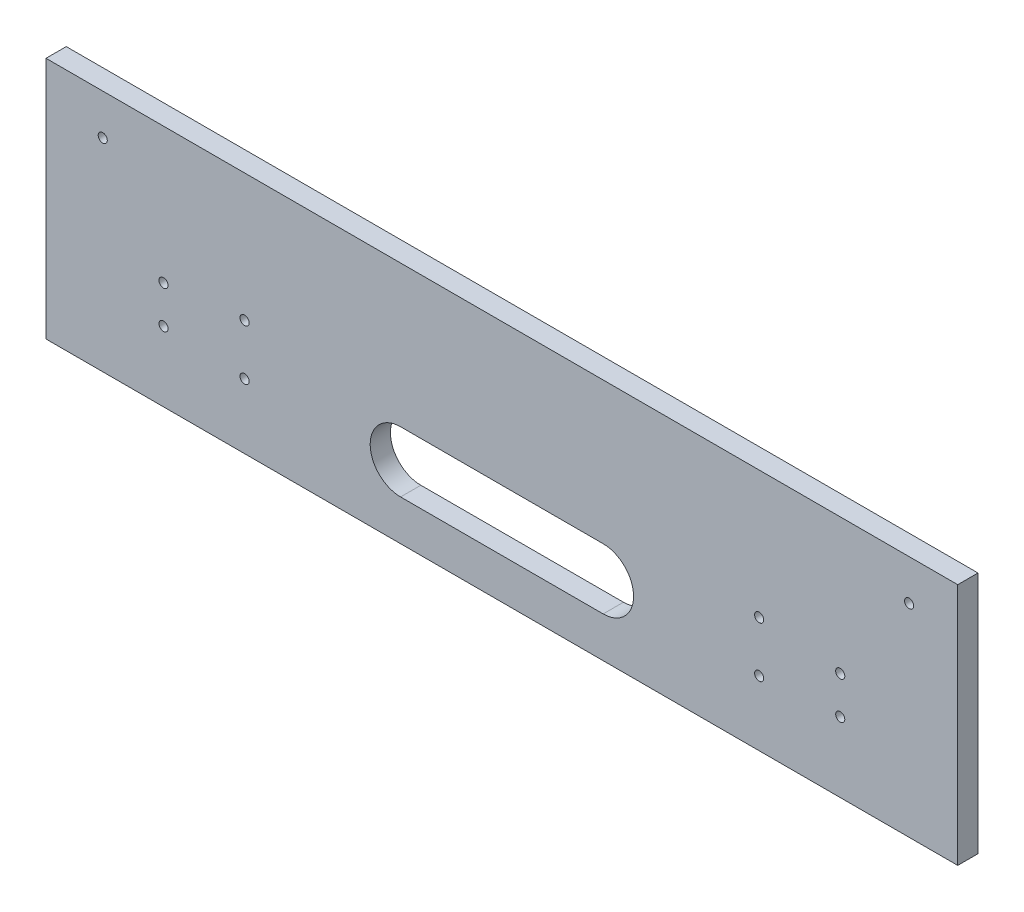
ISO-10303-21;
HEADER;
FILE_DESCRIPTION(('STEP AP214'),'2;1');
FILE_NAME('part.step','',(''),(''),'','','');
FILE_SCHEMA(('AUTOMOTIVE_DESIGN { 1 0 10303 214 1 1 1 1 }'));
ENDSEC;
DATA;
#1=APPLICATION_CONTEXT('core data for automotive mechanical design processes');
#2=APPLICATION_PROTOCOL_DEFINITION('international standard','automotive_design',2000,#1);
#3=PRODUCT_CONTEXT('',#1,'mechanical');
#4=PRODUCT('Part','Part','',(#3));
#5=PRODUCT_RELATED_PRODUCT_CATEGORY('part','',(#4));
#6=PRODUCT_DEFINITION_FORMATION('','',#4);
#7=PRODUCT_DEFINITION_CONTEXT('part definition',#1,'design');
#8=PRODUCT_DEFINITION('design','',#6,#7);
#9=PRODUCT_DEFINITION_SHAPE('','',#8);
#10=(LENGTH_UNIT() NAMED_UNIT(*) SI_UNIT(.MILLI.,.METRE.));
#11=(NAMED_UNIT(*) PLANE_ANGLE_UNIT() SI_UNIT($,.RADIAN.));
#12=(NAMED_UNIT(*) SI_UNIT($,.STERADIAN.) SOLID_ANGLE_UNIT());
#13=UNCERTAINTY_MEASURE_WITH_UNIT(LENGTH_MEASURE(1.E-05),#10,'distance_accuracy_value','');
#14=(GEOMETRIC_REPRESENTATION_CONTEXT(3) GLOBAL_UNCERTAINTY_ASSIGNED_CONTEXT((#13)) GLOBAL_UNIT_ASSIGNED_CONTEXT((#10,
#11,#12)) REPRESENTATION_CONTEXT('',''));
#15=CARTESIAN_POINT('',(0.,0.,0.));
#16=DIRECTION('',(0.,0.,1.));
#17=DIRECTION('',(1.,0.,0.));
#18=AXIS2_PLACEMENT_3D('',#15,#16,#17);
#19=CARTESIAN_POINT('',(-225.,60.,10.));
#20=DIRECTION('',(1.,0.,0.));
#21=DIRECTION('',(0.,0.,-1.));
#22=AXIS2_PLACEMENT_3D('',#19,#20,#21);
#23=PLANE('',#22);
#24=DIRECTION('',(0.,-1.,0.));
#25=VECTOR('',#24,1.);
#26=CARTESIAN_POINT('',(-225.,60.,0.));
#27=LINE('',#26,#25);
#28=CARTESIAN_POINT('',(-225.,60.,0.));
#29=VERTEX_POINT('',#28);
#30=CARTESIAN_POINT('',(-225.,-60.,0.));
#31=VERTEX_POINT('',#30);
#32=EDGE_CURVE('E138',#29,#31,#27,.T.);
#33=ORIENTED_EDGE('',*,*,#32,.T.);
#34=DIRECTION('',(0.,0.,-1.));
#35=VECTOR('',#34,1.);
#36=CARTESIAN_POINT('',(-225.,-60.,10.));
#37=LINE('',#36,#35);
#38=CARTESIAN_POINT('',(-225.,-60.,10.));
#39=VERTEX_POINT('',#38);
#40=EDGE_CURVE('E11',#39,#31,#37,.T.);
#41=ORIENTED_EDGE('',*,*,#40,.F.);
#42=DIRECTION('',(0.,-1.,0.));
#43=VECTOR('',#42,1.);
#44=CARTESIAN_POINT('',(-225.,60.,10.));
#45=LINE('',#44,#43);
#46=CARTESIAN_POINT('',(-225.,60.,10.));
#47=VERTEX_POINT('',#46);
#48=EDGE_CURVE('E142',#47,#39,#45,.T.);
#49=ORIENTED_EDGE('',*,*,#48,.F.);
#50=DIRECTION('',(0.,0.,-1.));
#51=VECTOR('',#50,1.);
#52=CARTESIAN_POINT('',(-225.,60.,10.));
#53=LINE('',#52,#51);
#54=EDGE_CURVE('E152',#47,#29,#53,.T.);
#55=ORIENTED_EDGE('',*,*,#54,.T.);
#56=EDGE_LOOP('',(#33,#41,#49,#55));
#57=FACE_BOUND('',#56,.T.);
#58=ADVANCED_FACE('F37',(#57),#23,.F.);
#59=CARTESIAN_POINT('',(-225.,-60.,10.));
#60=DIRECTION('',(0.,1.,0.));
#61=DIRECTION('',(0.,0.,1.));
#62=AXIS2_PLACEMENT_3D('',#59,#60,#61);
#63=PLANE('',#62);
#64=DIRECTION('',(1.,0.,0.));
#65=VECTOR('',#64,1.);
#66=CARTESIAN_POINT('',(-225.,-60.,0.));
#67=LINE('',#66,#65);
#68=CARTESIAN_POINT('',(225.,-60.,0.));
#69=VERTEX_POINT('',#68);
#70=EDGE_CURVE('E155',#31,#69,#67,.T.);
#71=ORIENTED_EDGE('',*,*,#70,.T.);
#72=DIRECTION('',(0.,0.,-1.));
#73=VECTOR('',#72,1.);
#74=CARTESIAN_POINT('',(225.,-60.,10.));
#75=LINE('',#74,#73);
#76=CARTESIAN_POINT('',(225.,-60.,10.));
#77=VERTEX_POINT('',#76);
#78=EDGE_CURVE('E44',#77,#69,#75,.T.);
#79=ORIENTED_EDGE('',*,*,#78,.F.);
#80=DIRECTION('',(1.,0.,0.));
#81=VECTOR('',#80,1.);
#82=CARTESIAN_POINT('',(-225.,-60.,10.));
#83=LINE('',#82,#81);
#84=EDGE_CURVE('E145',#39,#77,#83,.T.);
#85=ORIENTED_EDGE('',*,*,#84,.F.);
#86=ORIENTED_EDGE('',*,*,#40,.T.);
#87=EDGE_LOOP('',(#71,#79,#85,#86));
#88=FACE_BOUND('',#87,.T.);
#89=ADVANCED_FACE('F183',(#88),#63,.F.);
#90=CARTESIAN_POINT('',(225.,60.,10.));
#91=DIRECTION('',(-1.,0.,0.));
#92=DIRECTION('',(0.,-1.,0.));
#93=AXIS2_PLACEMENT_3D('',#90,#91,#92);
#94=PLANE('',#93);
#95=DIRECTION('',(0.,1.,0.));
#96=VECTOR('',#95,1.);
#97=CARTESIAN_POINT('',(225.,60.,0.));
#98=LINE('',#97,#96);
#99=CARTESIAN_POINT('',(225.,60.,0.));
#100=VERTEX_POINT('',#99);
#101=EDGE_CURVE('E157',#69,#100,#98,.T.);
#102=ORIENTED_EDGE('',*,*,#101,.T.);
#103=DIRECTION('',(0.,0.,-1.));
#104=VECTOR('',#103,1.);
#105=CARTESIAN_POINT('',(225.,60.,10.));
#106=LINE('',#105,#104);
#107=CARTESIAN_POINT('',(225.,60.,10.));
#108=VERTEX_POINT('',#107);
#109=EDGE_CURVE('E162',#108,#100,#106,.T.);
#110=ORIENTED_EDGE('',*,*,#109,.F.);
#111=DIRECTION('',(0.,1.,0.));
#112=VECTOR('',#111,1.);
#113=CARTESIAN_POINT('',(225.,60.,10.));
#114=LINE('',#113,#112);
#115=EDGE_CURVE('E148',#77,#108,#114,.T.);
#116=ORIENTED_EDGE('',*,*,#115,.F.);
#117=ORIENTED_EDGE('',*,*,#78,.T.);
#118=EDGE_LOOP('',(#102,#110,#116,#117));
#119=FACE_BOUND('',#118,.T.);
#120=ADVANCED_FACE('F169',(#119),#94,.F.);
#121=CARTESIAN_POINT('',(-225.,60.,10.));
#122=DIRECTION('',(0.,-1.,0.));
#123=DIRECTION('',(0.,0.,-1.));
#124=AXIS2_PLACEMENT_3D('',#121,#122,#123);
#125=PLANE('',#124);
#126=DIRECTION('',(-1.,0.,0.));
#127=VECTOR('',#126,1.);
#128=CARTESIAN_POINT('',(-225.,60.,0.));
#129=LINE('',#128,#127);
#130=EDGE_CURVE('E146',#100,#29,#129,.T.);
#131=ORIENTED_EDGE('',*,*,#130,.T.);
#132=ORIENTED_EDGE('',*,*,#54,.F.);
#133=DIRECTION('',(-1.,0.,0.));
#134=VECTOR('',#133,1.);
#135=CARTESIAN_POINT('',(-225.,60.,10.));
#136=LINE('',#135,#134);
#137=EDGE_CURVE('E150',#108,#47,#136,.T.);
#138=ORIENTED_EDGE('',*,*,#137,.F.);
#139=ORIENTED_EDGE('',*,*,#109,.T.);
#140=EDGE_LOOP('',(#131,#132,#138,#139));
#141=FACE_BOUND('',#140,.T.);
#142=ADVANCED_FACE('F176',(#141),#125,.F.);
#143=CARTESIAN_POINT('',(0.,0.,10.));
#144=DIRECTION('',(0.,0.,1.));
#145=DIRECTION('',(1.,0.,0.));
#146=AXIS2_PLACEMENT_3D('',#143,#144,#145);
#147=PLANE('',#146);
#148=CARTESIAN_POINT('',(127.,-3.,10.));
#149=DIRECTION('',(0.,0.,1.));
#150=DIRECTION('',(1.,0.,0.));
#151=AXIS2_PLACEMENT_3D('',#148,#149,#150);
#152=CIRCLE('',#151,2.25000000000001);
#153=CARTESIAN_POINT('',(129.25,-3.,10.));
#154=VERTEX_POINT('',#153);
#155=EDGE_CURVE('E272',#154,#154,#152,.T.);
#156=ORIENTED_EDGE('',*,*,#155,.F.);
#157=EDGE_LOOP('',(#156));
#158=FACE_BOUND('',#157,.T.);
#159=CARTESIAN_POINT('',(127.,-28.,10.));
#160=DIRECTION('',(0.,0.,1.));
#161=DIRECTION('',(1.,0.,0.));
#162=AXIS2_PLACEMENT_3D('',#159,#160,#161);
#163=CIRCLE('',#162,2.25000000000001);
#164=CARTESIAN_POINT('',(129.25,-28.,10.));
#165=VERTEX_POINT('',#164);
#166=EDGE_CURVE('E264',#165,#165,#163,.T.);
#167=ORIENTED_EDGE('',*,*,#166,.F.);
#168=EDGE_LOOP('',(#167));
#169=FACE_BOUND('',#168,.T.);
#170=CARTESIAN_POINT('',(-127.,-28.,10.));
#171=DIRECTION('',(0.,0.,1.));
#172=DIRECTION('',(1.,0.,0.));
#173=AXIS2_PLACEMENT_3D('',#170,#171,#172);
#174=CIRCLE('',#173,2.25000000000001);
#175=CARTESIAN_POINT('',(-124.75,-28.,10.));
#176=VERTEX_POINT('',#175);
#177=EDGE_CURVE('E257',#176,#176,#174,.T.);
#178=ORIENTED_EDGE('',*,*,#177,.F.);
#179=EDGE_LOOP('',(#178));
#180=FACE_BOUND('',#179,.T.);
#181=CARTESIAN_POINT('',(-127.,-3.,10.));
#182=DIRECTION('',(0.,0.,1.));
#183=DIRECTION('',(1.,0.,0.));
#184=AXIS2_PLACEMENT_3D('',#181,#182,#183);
#185=CIRCLE('',#184,2.25000000000001);
#186=CARTESIAN_POINT('',(-124.75,-3.,10.));
#187=VERTEX_POINT('',#186);
#188=EDGE_CURVE('E259',#187,#187,#185,.T.);
#189=ORIENTED_EDGE('',*,*,#188,.F.);
#190=EDGE_LOOP('',(#189));
#191=FACE_BOUND('',#190,.T.);
#192=CARTESIAN_POINT('',(201.,40.0000000000002,10.));
#193=DIRECTION('',(0.,0.,-1.));
#194=DIRECTION('',(-1.,0.,0.));
#195=AXIS2_PLACEMENT_3D('',#192,#193,#194);
#196=CIRCLE('',#195,2.25000000000001);
#197=CARTESIAN_POINT('',(198.75,40.0000000000002,10.));
#198=VERTEX_POINT('',#197);
#199=EDGE_CURVE('E279',#198,#198,#196,.T.);
#200=ORIENTED_EDGE('',*,*,#199,.T.);
#201=EDGE_LOOP('',(#200));
#202=FACE_BOUND('',#201,.T.);
#203=CARTESIAN_POINT('',(167.,-25.5000000000003,10.));
#204=DIRECTION('',(0.,0.,-1.));
#205=DIRECTION('',(-1.,0.,0.));
#206=AXIS2_PLACEMENT_3D('',#203,#204,#205);
#207=CIRCLE('',#206,2.25000000000001);
#208=CARTESIAN_POINT('',(164.75,-25.5000000000003,10.));
#209=VERTEX_POINT('',#208);
#210=EDGE_CURVE('E298',#209,#209,#207,.T.);
#211=ORIENTED_EDGE('',*,*,#210,.T.);
#212=EDGE_LOOP('',(#211));
#213=FACE_BOUND('',#212,.T.);
#214=CARTESIAN_POINT('',(-167.,-7.00000000000022,10.));
#215=DIRECTION('',(0.,0.,-1.));
#216=DIRECTION('',(-1.,0.,0.));
#217=AXIS2_PLACEMENT_3D('',#214,#215,#216);
#218=CIRCLE('',#217,2.25000000000001);
#219=CARTESIAN_POINT('',(-169.25,-7.00000000000022,10.));
#220=VERTEX_POINT('',#219);
#221=EDGE_CURVE('E284',#220,#220,#218,.T.);
#222=ORIENTED_EDGE('',*,*,#221,.T.);
#223=EDGE_LOOP('',(#222));
#224=FACE_BOUND('',#223,.T.);
#225=CARTESIAN_POINT('',(-167.,-25.5000000000002,10.));
#226=DIRECTION('',(0.,0.,-1.));
#227=DIRECTION('',(-1.,0.,0.));
#228=AXIS2_PLACEMENT_3D('',#225,#226,#227);
#229=CIRCLE('',#228,2.25000000000001);
#230=CARTESIAN_POINT('',(-169.25,-25.5000000000002,10.));
#231=VERTEX_POINT('',#230);
#232=EDGE_CURVE('E285',#231,#231,#229,.T.);
#233=ORIENTED_EDGE('',*,*,#232,.T.);
#234=EDGE_LOOP('',(#233));
#235=FACE_BOUND('',#234,.T.);
#236=CARTESIAN_POINT('',(-197.,40.0000000000023,10.));
#237=DIRECTION('',(0.,0.,-1.));
#238=DIRECTION('',(-1.,0.,0.));
#239=AXIS2_PLACEMENT_3D('',#236,#237,#238);
#240=CIRCLE('',#239,2.25000000000001);
#241=CARTESIAN_POINT('',(-199.25,40.0000000000023,10.));
#242=VERTEX_POINT('',#241);
#243=EDGE_CURVE('E291',#242,#242,#240,.T.);
#244=ORIENTED_EDGE('',*,*,#243,.T.);
#245=EDGE_LOOP('',(#244));
#246=FACE_BOUND('',#245,.T.);
#247=CARTESIAN_POINT('',(167.,-7.00000000000025,10.));
#248=DIRECTION('',(0.,0.,-1.));
#249=DIRECTION('',(-1.,0.,0.));
#250=AXIS2_PLACEMENT_3D('',#247,#248,#249);
#251=CIRCLE('',#250,2.25000000000001);
#252=CARTESIAN_POINT('',(164.75,-7.00000000000025,10.));
#253=VERTEX_POINT('',#252);
#254=EDGE_CURVE('E132',#253,#253,#251,.T.);
#255=ORIENTED_EDGE('',*,*,#254,.T.);
#256=EDGE_LOOP('',(#255));
#257=FACE_BOUND('',#256,.T.);
#258=CARTESIAN_POINT('',(-50.,-25.,10.));
#259=DIRECTION('',(0.,0.,1.));
#260=DIRECTION('',(1.,0.,0.));
#261=AXIS2_PLACEMENT_3D('',#258,#259,#260);
#262=CIRCLE('',#261,15.);
#263=CARTESIAN_POINT('',(-50.,-10.,10.));
#264=VERTEX_POINT('',#263);
#265=CARTESIAN_POINT('',(-50.,-40.,10.));
#266=VERTEX_POINT('',#265);
#267=EDGE_CURVE('E51',#264,#266,#262,.T.);
#268=ORIENTED_EDGE('',*,*,#267,.F.);
#269=DIRECTION('',(-1.,0.,0.));
#270=VECTOR('',#269,1.);
#271=CARTESIAN_POINT('',(-50.,-10.,10.));
#272=LINE('',#271,#270);
#273=CARTESIAN_POINT('',(50.,-9.99999999999999,10.));
#274=VERTEX_POINT('',#273);
#275=EDGE_CURVE('E119',#274,#264,#272,.T.);
#276=ORIENTED_EDGE('',*,*,#275,.F.);
#277=CARTESIAN_POINT('',(50.,-25.,10.));
#278=DIRECTION('',(0.,0.,1.));
#279=DIRECTION('',(1.,0.,0.));
#280=AXIS2_PLACEMENT_3D('',#277,#278,#279);
#281=CIRCLE('',#280,15.);
#282=CARTESIAN_POINT('',(50.,-40.,10.));
#283=VERTEX_POINT('',#282);
#284=EDGE_CURVE('E122',#283,#274,#281,.T.);
#285=ORIENTED_EDGE('',*,*,#284,.F.);
#286=DIRECTION('',(1.,0.,0.));
#287=VECTOR('',#286,1.);
#288=CARTESIAN_POINT('',(-50.,-40.,10.));
#289=LINE('',#288,#287);
#290=EDGE_CURVE('E131',#266,#283,#289,.T.);
#291=ORIENTED_EDGE('',*,*,#290,.F.);
#292=EDGE_LOOP('',(#268,#276,#285,#291));
#293=FACE_BOUND('',#292,.T.);
#294=ORIENTED_EDGE('',*,*,#48,.T.);
#295=ORIENTED_EDGE('',*,*,#84,.T.);
#296=ORIENTED_EDGE('',*,*,#115,.T.);
#297=ORIENTED_EDGE('',*,*,#137,.T.);
#298=EDGE_LOOP('',(#294,#295,#296,#297));
#299=FACE_BOUND('',#298,.T.);
#300=ADVANCED_FACE('F182',(#158,#169,#180,#191,#202,#213,#224,#235,#246,#257,#293,#299),#147,.T.);
#301=CARTESIAN_POINT('',(0.,0.,0.));
#302=DIRECTION('',(0.,0.,1.));
#303=DIRECTION('',(1.,0.,0.));
#304=AXIS2_PLACEMENT_3D('',#301,#302,#303);
#305=PLANE('',#304);
#306=CARTESIAN_POINT('',(127.,-3.,0.));
#307=DIRECTION('',(0.,0.,1.));
#308=DIRECTION('',(1.,0.,0.));
#309=AXIS2_PLACEMENT_3D('',#306,#307,#308);
#310=CIRCLE('',#309,2.25000000000001);
#311=CARTESIAN_POINT('',(129.25,-3.,0.));
#312=VERTEX_POINT('',#311);
#313=EDGE_CURVE('E275',#312,#312,#310,.T.);
#314=ORIENTED_EDGE('',*,*,#313,.T.);
#315=EDGE_LOOP('',(#314));
#316=FACE_BOUND('',#315,.T.);
#317=CARTESIAN_POINT('',(127.,-28.,0.));
#318=DIRECTION('',(0.,0.,1.));
#319=DIRECTION('',(1.,0.,0.));
#320=AXIS2_PLACEMENT_3D('',#317,#318,#319);
#321=CIRCLE('',#320,2.25000000000001);
#322=CARTESIAN_POINT('',(129.25,-28.,0.));
#323=VERTEX_POINT('',#322);
#324=EDGE_CURVE('E269',#323,#323,#321,.T.);
#325=ORIENTED_EDGE('',*,*,#324,.T.);
#326=EDGE_LOOP('',(#325));
#327=FACE_BOUND('',#326,.T.);
#328=CARTESIAN_POINT('',(-127.,-28.,0.));
#329=DIRECTION('',(0.,0.,1.));
#330=DIRECTION('',(1.,0.,0.));
#331=AXIS2_PLACEMENT_3D('',#328,#329,#330);
#332=CIRCLE('',#331,2.25000000000001);
#333=CARTESIAN_POINT('',(-124.75,-28.,0.));
#334=VERTEX_POINT('',#333);
#335=EDGE_CURVE('E254',#334,#334,#332,.T.);
#336=ORIENTED_EDGE('',*,*,#335,.T.);
#337=EDGE_LOOP('',(#336));
#338=FACE_BOUND('',#337,.T.);
#339=CARTESIAN_POINT('',(-127.,-3.,0.));
#340=DIRECTION('',(0.,0.,1.));
#341=DIRECTION('',(1.,0.,0.));
#342=AXIS2_PLACEMENT_3D('',#339,#340,#341);
#343=CIRCLE('',#342,2.25000000000001);
#344=CARTESIAN_POINT('',(-124.75,-3.,0.));
#345=VERTEX_POINT('',#344);
#346=EDGE_CURVE('E262',#345,#345,#343,.T.);
#347=ORIENTED_EDGE('',*,*,#346,.T.);
#348=EDGE_LOOP('',(#347));
#349=FACE_BOUND('',#348,.T.);
#350=CARTESIAN_POINT('',(201.,40.0000000000002,0.));
#351=DIRECTION('',(0.,0.,-1.));
#352=DIRECTION('',(-1.,0.,0.));
#353=AXIS2_PLACEMENT_3D('',#350,#351,#352);
#354=CIRCLE('',#353,2.25000000000001);
#355=CARTESIAN_POINT('',(198.75,40.0000000000002,0.));
#356=VERTEX_POINT('',#355);
#357=EDGE_CURVE('E294',#356,#356,#354,.T.);
#358=ORIENTED_EDGE('',*,*,#357,.F.);
#359=EDGE_LOOP('',(#358));
#360=FACE_BOUND('',#359,.T.);
#361=CARTESIAN_POINT('',(167.,-25.5000000000003,0.));
#362=DIRECTION('',(0.,0.,-1.));
#363=DIRECTION('',(-1.,0.,0.));
#364=AXIS2_PLACEMENT_3D('',#361,#362,#363);
#365=CIRCLE('',#364,2.25000000000001);
#366=CARTESIAN_POINT('',(164.75,-25.5000000000003,0.));
#367=VERTEX_POINT('',#366);
#368=EDGE_CURVE('E295',#367,#367,#365,.T.);
#369=ORIENTED_EDGE('',*,*,#368,.F.);
#370=EDGE_LOOP('',(#369));
#371=FACE_BOUND('',#370,.T.);
#372=CARTESIAN_POINT('',(-167.,-7.00000000000022,0.));
#373=DIRECTION('',(0.,0.,-1.));
#374=DIRECTION('',(-1.,0.,0.));
#375=AXIS2_PLACEMENT_3D('',#372,#373,#374);
#376=CIRCLE('',#375,2.25000000000001);
#377=CARTESIAN_POINT('',(-169.25,-7.00000000000022,0.));
#378=VERTEX_POINT('',#377);
#379=EDGE_CURVE('E301',#378,#378,#376,.T.);
#380=ORIENTED_EDGE('',*,*,#379,.F.);
#381=EDGE_LOOP('',(#380));
#382=FACE_BOUND('',#381,.T.);
#383=CARTESIAN_POINT('',(-167.,-25.5000000000002,0.));
#384=DIRECTION('',(0.,0.,-1.));
#385=DIRECTION('',(-1.,0.,0.));
#386=AXIS2_PLACEMENT_3D('',#383,#384,#385);
#387=CIRCLE('',#386,2.25000000000001);
#388=CARTESIAN_POINT('',(-169.25,-25.5000000000002,0.));
#389=VERTEX_POINT('',#388);
#390=EDGE_CURVE('E281',#389,#389,#387,.T.);
#391=ORIENTED_EDGE('',*,*,#390,.F.);
#392=EDGE_LOOP('',(#391));
#393=FACE_BOUND('',#392,.T.);
#394=CARTESIAN_POINT('',(-197.,40.0000000000023,0.));
#395=DIRECTION('',(0.,0.,-1.));
#396=DIRECTION('',(-1.,0.,0.));
#397=AXIS2_PLACEMENT_3D('',#394,#395,#396);
#398=CIRCLE('',#397,2.25000000000001);
#399=CARTESIAN_POINT('',(-199.25,40.0000000000023,0.));
#400=VERTEX_POINT('',#399);
#401=EDGE_CURVE('E288',#400,#400,#398,.T.);
#402=ORIENTED_EDGE('',*,*,#401,.F.);
#403=EDGE_LOOP('',(#402));
#404=FACE_BOUND('',#403,.T.);
#405=CARTESIAN_POINT('',(167.,-7.00000000000025,0.));
#406=DIRECTION('',(0.,0.,-1.));
#407=DIRECTION('',(-1.,0.,0.));
#408=AXIS2_PLACEMENT_3D('',#405,#406,#407);
#409=CIRCLE('',#408,2.25000000000001);
#410=CARTESIAN_POINT('',(164.75,-7.00000000000025,0.));
#411=VERTEX_POINT('',#410);
#412=EDGE_CURVE('E125',#411,#411,#409,.T.);
#413=ORIENTED_EDGE('',*,*,#412,.F.);
#414=EDGE_LOOP('',(#413));
#415=FACE_BOUND('',#414,.T.);
#416=DIRECTION('',(-1.,0.,0.));
#417=VECTOR('',#416,1.);
#418=CARTESIAN_POINT('',(-50.,-10.,0.));
#419=LINE('',#418,#417);
#420=CARTESIAN_POINT('',(50.,-9.99999999999999,0.));
#421=VERTEX_POINT('',#420);
#422=CARTESIAN_POINT('',(-50.,-10.,0.));
#423=VERTEX_POINT('',#422);
#424=EDGE_CURVE('E109',#421,#423,#419,.T.);
#425=ORIENTED_EDGE('',*,*,#424,.T.);
#426=CARTESIAN_POINT('',(-50.,-25.,0.));
#427=DIRECTION('',(0.,0.,1.));
#428=DIRECTION('',(1.,0.,0.));
#429=AXIS2_PLACEMENT_3D('',#426,#427,#428);
#430=CIRCLE('',#429,15.);
#431=CARTESIAN_POINT('',(-50.,-40.,0.));
#432=VERTEX_POINT('',#431);
#433=EDGE_CURVE('E103',#423,#432,#430,.T.);
#434=ORIENTED_EDGE('',*,*,#433,.T.);
#435=DIRECTION('',(1.,0.,0.));
#436=VECTOR('',#435,1.);
#437=CARTESIAN_POINT('',(-50.,-40.,0.));
#438=LINE('',#437,#436);
#439=CARTESIAN_POINT('',(50.,-40.,0.));
#440=VERTEX_POINT('',#439);
#441=EDGE_CURVE('E112',#432,#440,#438,.T.);
#442=ORIENTED_EDGE('',*,*,#441,.T.);
#443=CARTESIAN_POINT('',(50.,-25.,0.));
#444=DIRECTION('',(0.,0.,1.));
#445=DIRECTION('',(1.,0.,0.));
#446=AXIS2_PLACEMENT_3D('',#443,#444,#445);
#447=CIRCLE('',#446,15.);
#448=EDGE_CURVE('E59',#440,#421,#447,.T.);
#449=ORIENTED_EDGE('',*,*,#448,.T.);
#450=EDGE_LOOP('',(#425,#434,#442,#449));
#451=FACE_BOUND('',#450,.T.);
#452=ORIENTED_EDGE('',*,*,#32,.F.);
#453=ORIENTED_EDGE('',*,*,#130,.F.);
#454=ORIENTED_EDGE('',*,*,#101,.F.);
#455=ORIENTED_EDGE('',*,*,#70,.F.);
#456=EDGE_LOOP('',(#452,#453,#454,#455));
#457=FACE_BOUND('',#456,.T.);
#458=ADVANCED_FACE('F116',(#316,#327,#338,#349,#360,#371,#382,#393,#404,#415,#451,#457),#305,.F.);
#459=CARTESIAN_POINT('',(-50.,-25.,0.));
#460=DIRECTION('',(0.,0.,1.));
#461=DIRECTION('',(1.,0.,0.));
#462=AXIS2_PLACEMENT_3D('',#459,#460,#461);
#463=CYLINDRICAL_SURFACE('',#462,15.);
#464=ORIENTED_EDGE('',*,*,#267,.T.);
#465=DIRECTION('',(0.,0.,1.));
#466=VECTOR('',#465,1.);
#467=CARTESIAN_POINT('',(-50.,-40.,0.));
#468=LINE('',#467,#466);
#469=EDGE_CURVE('E99',#432,#266,#468,.T.);
#470=ORIENTED_EDGE('',*,*,#469,.F.);
#471=ORIENTED_EDGE('',*,*,#433,.F.);
#472=DIRECTION('',(0.,0.,1.));
#473=VECTOR('',#472,1.);
#474=CARTESIAN_POINT('',(-50.,-10.,0.));
#475=LINE('',#474,#473);
#476=EDGE_CURVE('E136',#423,#264,#475,.T.);
#477=ORIENTED_EDGE('',*,*,#476,.T.);
#478=EDGE_LOOP('',(#464,#470,#471,#477));
#479=FACE_BOUND('',#478,.T.);
#480=ADVANCED_FACE('F101',(#479),#463,.F.);
#481=CARTESIAN_POINT('',(-50.,-10.,0.));
#482=DIRECTION('',(0.,1.,0.));
#483=DIRECTION('',(-1.,0.,0.));
#484=AXIS2_PLACEMENT_3D('',#481,#482,#483);
#485=PLANE('',#484);
#486=ORIENTED_EDGE('',*,*,#275,.T.);
#487=ORIENTED_EDGE('',*,*,#476,.F.);
#488=ORIENTED_EDGE('',*,*,#424,.F.);
#489=DIRECTION('',(0.,0.,1.));
#490=VECTOR('',#489,1.);
#491=CARTESIAN_POINT('',(50.,-9.99999999999999,0.));
#492=LINE('',#491,#490);
#493=EDGE_CURVE('E139',#421,#274,#492,.T.);
#494=ORIENTED_EDGE('',*,*,#493,.T.);
#495=EDGE_LOOP('',(#486,#487,#488,#494));
#496=FACE_BOUND('',#495,.T.);
#497=ADVANCED_FACE('F201',(#496),#485,.F.);
#498=CARTESIAN_POINT('',(50.,-25.,0.));
#499=DIRECTION('',(0.,0.,1.));
#500=DIRECTION('',(1.,0.,0.));
#501=AXIS2_PLACEMENT_3D('',#498,#499,#500);
#502=CYLINDRICAL_SURFACE('',#501,15.);
#503=ORIENTED_EDGE('',*,*,#284,.T.);
#504=ORIENTED_EDGE('',*,*,#493,.F.);
#505=ORIENTED_EDGE('',*,*,#448,.F.);
#506=DIRECTION('',(0.,0.,1.));
#507=VECTOR('',#506,1.);
#508=CARTESIAN_POINT('',(50.,-40.,0.));
#509=LINE('',#508,#507);
#510=EDGE_CURVE('E108',#440,#283,#509,.T.);
#511=ORIENTED_EDGE('',*,*,#510,.T.);
#512=EDGE_LOOP('',(#503,#504,#505,#511));
#513=FACE_BOUND('',#512,.T.);
#514=ADVANCED_FACE('F205',(#513),#502,.F.);
#515=CARTESIAN_POINT('',(-50.,-40.,0.));
#516=DIRECTION('',(0.,-1.,0.));
#517=DIRECTION('',(1.,0.,0.));
#518=AXIS2_PLACEMENT_3D('',#515,#516,#517);
#519=PLANE('',#518);
#520=ORIENTED_EDGE('',*,*,#290,.T.);
#521=ORIENTED_EDGE('',*,*,#510,.F.);
#522=ORIENTED_EDGE('',*,*,#441,.F.);
#523=ORIENTED_EDGE('',*,*,#469,.T.);
#524=EDGE_LOOP('',(#520,#521,#522,#523));
#525=FACE_BOUND('',#524,.T.);
#526=ADVANCED_FACE('F113',(#525),#519,.F.);
#527=CARTESIAN_POINT('',(167.,-7.00000000000025,10.));
#528=DIRECTION('',(0.,0.,-1.));
#529=DIRECTION('',(-1.,0.,0.));
#530=AXIS2_PLACEMENT_3D('',#527,#528,#529);
#531=CYLINDRICAL_SURFACE('',#530,2.25000000000001);
#532=ORIENTED_EDGE('',*,*,#254,.F.);
#533=EDGE_LOOP('',(#532));
#534=FACE_BOUND('',#533,.T.);
#535=ORIENTED_EDGE('',*,*,#412,.T.);
#536=EDGE_LOOP('',(#535));
#537=FACE_BOUND('',#536,.T.);
#538=ADVANCED_FACE('F204',(#534,#537),#531,.F.);
#539=CARTESIAN_POINT('',(-197.,40.0000000000023,10.));
#540=DIRECTION('',(0.,0.,-1.));
#541=DIRECTION('',(-1.,0.,0.));
#542=AXIS2_PLACEMENT_3D('',#539,#540,#541);
#543=CYLINDRICAL_SURFACE('',#542,2.25000000000001);
#544=ORIENTED_EDGE('',*,*,#243,.F.);
#545=EDGE_LOOP('',(#544));
#546=FACE_BOUND('',#545,.T.);
#547=ORIENTED_EDGE('',*,*,#401,.T.);
#548=EDGE_LOOP('',(#547));
#549=FACE_BOUND('',#548,.T.);
#550=ADVANCED_FACE('F213',(#546,#549),#543,.F.);
#551=CARTESIAN_POINT('',(-167.,-25.5000000000002,10.));
#552=DIRECTION('',(0.,0.,-1.));
#553=DIRECTION('',(-1.,0.,0.));
#554=AXIS2_PLACEMENT_3D('',#551,#552,#553);
#555=CYLINDRICAL_SURFACE('',#554,2.25000000000001);
#556=ORIENTED_EDGE('',*,*,#232,.F.);
#557=EDGE_LOOP('',(#556));
#558=FACE_BOUND('',#557,.T.);
#559=ORIENTED_EDGE('',*,*,#390,.T.);
#560=EDGE_LOOP('',(#559));
#561=FACE_BOUND('',#560,.T.);
#562=ADVANCED_FACE('F224',(#558,#561),#555,.F.);
#563=CARTESIAN_POINT('',(-167.,-7.00000000000022,10.));
#564=DIRECTION('',(0.,0.,-1.));
#565=DIRECTION('',(-1.,0.,0.));
#566=AXIS2_PLACEMENT_3D('',#563,#564,#565);
#567=CYLINDRICAL_SURFACE('',#566,2.25000000000001);
#568=ORIENTED_EDGE('',*,*,#221,.F.);
#569=EDGE_LOOP('',(#568));
#570=FACE_BOUND('',#569,.T.);
#571=ORIENTED_EDGE('',*,*,#379,.T.);
#572=EDGE_LOOP('',(#571));
#573=FACE_BOUND('',#572,.T.);
#574=ADVANCED_FACE('F221',(#570,#573),#567,.F.);
#575=CARTESIAN_POINT('',(167.,-25.5000000000003,10.));
#576=DIRECTION('',(0.,0.,-1.));
#577=DIRECTION('',(-1.,0.,0.));
#578=AXIS2_PLACEMENT_3D('',#575,#576,#577);
#579=CYLINDRICAL_SURFACE('',#578,2.25000000000001);
#580=ORIENTED_EDGE('',*,*,#210,.F.);
#581=EDGE_LOOP('',(#580));
#582=FACE_BOUND('',#581,.T.);
#583=ORIENTED_EDGE('',*,*,#368,.T.);
#584=EDGE_LOOP('',(#583));
#585=FACE_BOUND('',#584,.T.);
#586=ADVANCED_FACE('F219',(#582,#585),#579,.F.);
#587=CARTESIAN_POINT('',(201.,40.0000000000002,10.));
#588=DIRECTION('',(0.,0.,-1.));
#589=DIRECTION('',(-1.,0.,0.));
#590=AXIS2_PLACEMENT_3D('',#587,#588,#589);
#591=CYLINDRICAL_SURFACE('',#590,2.25000000000001);
#592=ORIENTED_EDGE('',*,*,#199,.F.);
#593=EDGE_LOOP('',(#592));
#594=FACE_BOUND('',#593,.T.);
#595=ORIENTED_EDGE('',*,*,#357,.T.);
#596=EDGE_LOOP('',(#595));
#597=FACE_BOUND('',#596,.T.);
#598=ADVANCED_FACE('F215',(#594,#597),#591,.F.);
#599=CARTESIAN_POINT('',(-127.,-3.,0.));
#600=DIRECTION('',(0.,0.,1.));
#601=DIRECTION('',(1.,0.,0.));
#602=AXIS2_PLACEMENT_3D('',#599,#600,#601);
#603=CYLINDRICAL_SURFACE('',#602,2.25000000000001);
#604=ORIENTED_EDGE('',*,*,#346,.F.);
#605=EDGE_LOOP('',(#604));
#606=FACE_BOUND('',#605,.T.);
#607=ORIENTED_EDGE('',*,*,#188,.T.);
#608=EDGE_LOOP('',(#607));
#609=FACE_BOUND('',#608,.T.);
#610=ADVANCED_FACE('F218',(#606,#609),#603,.F.);
#611=CARTESIAN_POINT('',(-127.,-28.,0.));
#612=DIRECTION('',(0.,0.,1.));
#613=DIRECTION('',(1.,0.,0.));
#614=AXIS2_PLACEMENT_3D('',#611,#612,#613);
#615=CYLINDRICAL_SURFACE('',#614,2.25000000000001);
#616=ORIENTED_EDGE('',*,*,#335,.F.);
#617=EDGE_LOOP('',(#616));
#618=FACE_BOUND('',#617,.T.);
#619=ORIENTED_EDGE('',*,*,#177,.T.);
#620=EDGE_LOOP('',(#619));
#621=FACE_BOUND('',#620,.T.);
#622=ADVANCED_FACE('F237',(#618,#621),#615,.F.);
#623=CARTESIAN_POINT('',(127.,-28.,0.));
#624=DIRECTION('',(0.,0.,1.));
#625=DIRECTION('',(1.,0.,0.));
#626=AXIS2_PLACEMENT_3D('',#623,#624,#625);
#627=CYLINDRICAL_SURFACE('',#626,2.25000000000001);
#628=ORIENTED_EDGE('',*,*,#324,.F.);
#629=EDGE_LOOP('',(#628));
#630=FACE_BOUND('',#629,.T.);
#631=ORIENTED_EDGE('',*,*,#166,.T.);
#632=EDGE_LOOP('',(#631));
#633=FACE_BOUND('',#632,.T.);
#634=ADVANCED_FACE('F242',(#630,#633),#627,.F.);
#635=CARTESIAN_POINT('',(127.,-3.,0.));
#636=DIRECTION('',(0.,0.,1.));
#637=DIRECTION('',(1.,0.,0.));
#638=AXIS2_PLACEMENT_3D('',#635,#636,#637);
#639=CYLINDRICAL_SURFACE('',#638,2.25000000000001);
#640=ORIENTED_EDGE('',*,*,#313,.F.);
#641=EDGE_LOOP('',(#640));
#642=FACE_BOUND('',#641,.T.);
#643=ORIENTED_EDGE('',*,*,#155,.T.);
#644=EDGE_LOOP('',(#643));
#645=FACE_BOUND('',#644,.T.);
#646=ADVANCED_FACE('F239',(#642,#645),#639,.F.);
#647=CLOSED_SHELL('',(#58,#89,#120,#142,#300,#458,#480,#497,#514,#526,#538,#550,#562,#574,#586,
#598,#610,#622,#634,#646));
#648=MANIFOLD_SOLID_BREP('B2',#647);
#649=ADVANCED_BREP_SHAPE_REPRESENTATION('',(#18,#648),#14);
#650=SHAPE_DEFINITION_REPRESENTATION(#9,#649);
ENDSEC;
END-ISO-10303-21;
